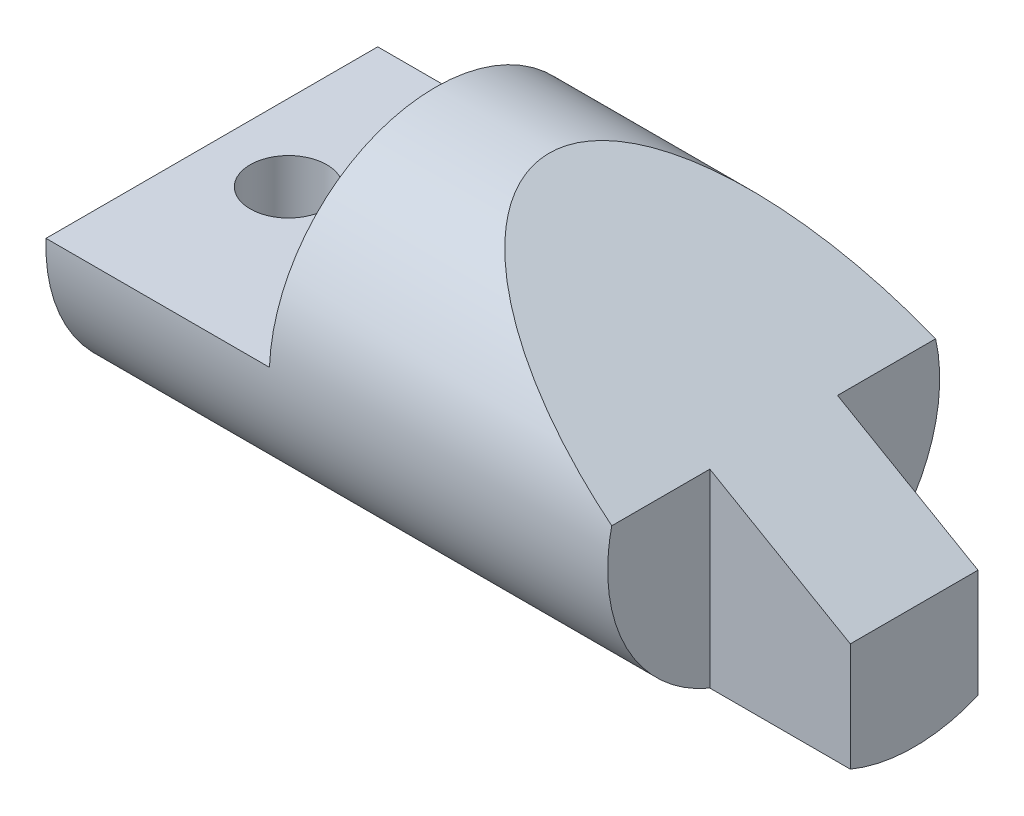
ISO-10303-21;
HEADER;
FILE_DESCRIPTION(('STEP AP214'),'2;1');
FILE_NAME('part.step','',(''),(''),'','','');
FILE_SCHEMA(('AUTOMOTIVE_DESIGN { 1 0 10303 214 1 1 1 1 }'));
ENDSEC;
DATA;
#1=APPLICATION_CONTEXT('core data for automotive mechanical design processes');
#2=APPLICATION_PROTOCOL_DEFINITION('international standard','automotive_design',2000,#1);
#3=PRODUCT_CONTEXT('',#1,'mechanical');
#4=PRODUCT('Part','Part','',(#3));
#5=PRODUCT_RELATED_PRODUCT_CATEGORY('part','',(#4));
#6=PRODUCT_DEFINITION_FORMATION('','',#4);
#7=PRODUCT_DEFINITION_CONTEXT('part definition',#1,'design');
#8=PRODUCT_DEFINITION('design','',#6,#7);
#9=PRODUCT_DEFINITION_SHAPE('','',#8);
#10=(LENGTH_UNIT() NAMED_UNIT(*) SI_UNIT(.MILLI.,.METRE.));
#11=(NAMED_UNIT(*) PLANE_ANGLE_UNIT() SI_UNIT($,.RADIAN.));
#12=(NAMED_UNIT(*) SI_UNIT($,.STERADIAN.) SOLID_ANGLE_UNIT());
#13=UNCERTAINTY_MEASURE_WITH_UNIT(LENGTH_MEASURE(1.E-05),#10,'distance_accuracy_value','');
#14=(GEOMETRIC_REPRESENTATION_CONTEXT(3) GLOBAL_UNCERTAINTY_ASSIGNED_CONTEXT((#13)) GLOBAL_UNIT_ASSIGNED_CONTEXT((#10,
#11,#12)) REPRESENTATION_CONTEXT('',''));
#15=CARTESIAN_POINT('',(0.,0.,0.));
#16=DIRECTION('',(0.,0.,1.));
#17=DIRECTION('',(1.,0.,0.));
#18=AXIS2_PLACEMENT_3D('',#15,#16,#17);
#19=CARTESIAN_POINT('',(110.,0.,0.));
#20=DIRECTION('',(-1.,0.,0.));
#21=DIRECTION('',(0.,0.,1.));
#22=AXIS2_PLACEMENT_3D('',#19,#20,#21);
#23=CYLINDRICAL_SURFACE('',#22,26.);
#24=CARTESIAN_POINT('',(12.,-25.298221281347,6.));
#25=CARTESIAN_POINT('',(11.8338596092283,-25.2982186168234,6.00000426699578));
#26=CARTESIAN_POINT('',(11.6677682398889,-25.2998607859314,5.99309795994757));
#27=CARTESIAN_POINT('',(11.3367454187584,-25.3063739393443,5.96553937626017));
#28=CARTESIAN_POINT('',(11.171814129202,-25.3112453665251,5.94488521417248));
#29=CARTESIAN_POINT('',(10.8442914295955,-25.3240766640158,5.88998541702547));
#30=CARTESIAN_POINT('',(10.6817009897915,-25.3320377787861,5.85573430527684));
#31=CARTESIAN_POINT('',(10.3600133150648,-25.3508138996234,5.77390652099875));
#32=CARTESIAN_POINT('',(10.2009173930992,-25.3616299591317,5.72632492927967));
#33=CARTESIAN_POINT('',(9.88763244979479,-25.3857782730932,5.61830189272332));
#34=CARTESIAN_POINT('',(9.73343615850164,-25.3991065745931,5.55788063202718));
#35=CARTESIAN_POINT('',(9.43067431566343,-25.4279121015355,5.4245677515505));
#36=CARTESIAN_POINT('',(9.28211086812178,-25.4433901200766,5.35167152704644));
#37=CARTESIAN_POINT('',(8.99171038121903,-25.4760474563589,5.19398525284812));
#38=CARTESIAN_POINT('',(8.84987073853116,-25.4932261075591,5.10919985757711));
#39=CARTESIAN_POINT('',(8.57371971231115,-25.5288197408225,4.92827180844513));
#40=CARTESIAN_POINT('',(8.43941117979342,-25.5472351853712,4.83212489574422));
#41=CARTESIAN_POINT('',(8.17708400889766,-25.5851042747505,4.62746622255838));
#42=CARTESIAN_POINT('',(8.04920607675449,-25.6045700506075,4.51877631184721));
#43=CARTESIAN_POINT('',(7.80297159714609,-25.6437178101008,4.29104725883859));
#44=CARTESIAN_POINT('',(7.68461859949208,-25.6633998712663,4.17200429217533));
#45=CARTESIAN_POINT('',(7.45830580131009,-25.702423281932,3.92442775118071));
#46=CARTESIAN_POINT('',(7.35034308479037,-25.721764725773,3.79589685759739));
#47=CARTESIAN_POINT('',(7.14546982000557,-25.7595869691649,3.53011349345323));
#48=CARTESIAN_POINT('',(7.04856335802128,-25.7780674490287,3.39285782730012));
#49=CARTESIAN_POINT('',(6.86548641571272,-25.8138543103492,3.1089581991746));
#50=CARTESIAN_POINT('',(6.77945138072909,-25.8311448485142,2.96222482563555));
#51=CARTESIAN_POINT('',(6.62004187971231,-25.8638330810239,2.66176458350471));
#52=CARTESIAN_POINT('',(6.54667218486704,-25.879230061417,2.50803510683321));
#53=CARTESIAN_POINT('',(6.41323326811326,-25.9076764656952,2.19476325401493));
#54=CARTESIAN_POINT('',(6.35315782033565,-25.9207269879179,2.03522363977197));
#55=CARTESIAN_POINT('',(6.24673180092865,-25.9441215771745,1.71143932954673));
#56=CARTESIAN_POINT('',(6.2003861804684,-25.9544646677143,1.5471929596019));
#57=CARTESIAN_POINT('',(6.08400245976789,-25.9806279305608,1.05494501508443));
#58=CARTESIAN_POINT('',(6.03413177498501,-25.9921298380189,0.721572970925529));
#59=CARTESIAN_POINT('',(6.00164160636246,-25.9996222178507,0.219200696397592));
#60=CARTESIAN_POINT('',(5.997871100763,-26.0004913374011,0.0512905335849101));
#61=CARTESIAN_POINT('',(6.00439061305633,-25.9989867752056,-0.28426266864682));
#62=CARTESIAN_POINT('',(6.01468081721394,-25.9966130505011,-0.451905704497733));
#63=CARTESIAN_POINT('',(6.06595399040325,-25.9848332325725,-0.946143346731944));
#64=CARTESIAN_POINT('',(6.12692197032201,-25.9708629188291,-1.27078082255708));
#65=CARTESIAN_POINT('',(6.30091545747847,-25.9320748267591,-1.90491648972239));
#66=CARTESIAN_POINT('',(6.41394348546702,-25.907256523175,-2.21441394717911));
#67=CARTESIAN_POINT('',(6.68975214973851,-25.8491870231339,-2.81256896635929));
#68=CARTESIAN_POINT('',(6.85292259116338,-25.8158701164867,-3.10104052915992));
#69=CARTESIAN_POINT('',(7.22409121318011,-25.7444407348534,-3.64687359141418));
#70=CARTESIAN_POINT('',(7.43209613847233,-25.7063275386942,-3.90423040100034));
#71=CARTESIAN_POINT('',(7.89272700140077,-25.6284430543298,-4.38681075802379));
#72=CARTESIAN_POINT('',(8.14627364587873,-25.588653804612,-4.61115349777712));
#73=CARTESIAN_POINT('',(8.68780493189074,-25.5127202462123,-5.0143111751951));
#74=CARTESIAN_POINT('',(8.97579073322763,-25.4765760603604,-5.19312457893953));
#75=CARTESIAN_POINT('',(9.57956102723888,-25.4119707291034,-5.5006028741194));
#76=CARTESIAN_POINT('',(9.89544202964118,-25.3835377625613,-5.62908458008033));
#77=CARTESIAN_POINT('',(10.5451271094168,-25.3379522391704,-5.83086533091266));
#78=CARTESIAN_POINT('',(10.8789279724591,-25.3207976665517,-5.90417423707244));
#79=CARTESIAN_POINT('',(11.5468836785248,-25.3001269614723,-5.99212728798865));
#80=CARTESIAN_POINT('',(11.8808595896817,-25.2963109960261,-6.00806138849856));
#81=CARTESIAN_POINT('',(12.5466961543681,-25.3019380241938,-5.98431936297218));
#82=CARTESIAN_POINT('',(12.8785569691508,-25.3113799945877,-5.94464752848658));
#83=CARTESIAN_POINT('',(13.5261421610431,-25.3421742930984,-5.8119438680545));
#84=CARTESIAN_POINT('',(13.8420236017125,-25.363364612613,-5.71963738596624));
#85=CARTESIAN_POINT('',(14.4538352052248,-25.415119049277,-5.48507577932331));
#86=CARTESIAN_POINT('',(14.7497632805569,-25.4456841453603,-5.34281543825688));
#87=CARTESIAN_POINT('',(15.3188058686108,-25.513392623152,-5.00959972635545));
#88=CARTESIAN_POINT('',(15.5914476089792,-25.5506389044147,-4.81785842909055));
#89=CARTESIAN_POINT('',(16.1011625009439,-25.6272493902105,-4.39212255336452));
#90=CARTESIAN_POINT('',(16.3382307011576,-25.6666138885384,-4.15812210293797));
#91=CARTESIAN_POINT('',(16.7751392585067,-25.7440220559931,-3.64870430326475));
#92=CARTESIAN_POINT('',(16.9740950132877,-25.7820207369392,-3.3725215516733));
#93=CARTESIAN_POINT('',(17.3228366844758,-25.8515613819952,-2.78971810867866));
#94=CARTESIAN_POINT('',(17.4726250217897,-25.8831036639768,-2.48309891687435));
#95=CARTESIAN_POINT('',(17.6564412006975,-25.9228060540511,-2.00832516560109));
#96=CARTESIAN_POINT('',(17.7108034430978,-25.9347480305856,-1.84807757920985));
#97=CARTESIAN_POINT('',(17.8058398876408,-25.9558394938161,-1.52340969359614));
#98=CARTESIAN_POINT('',(17.8465191923752,-25.9649900213704,-1.35899097451099));
#99=CARTESIAN_POINT('',(17.9138487056317,-25.9802335618391,-1.0271663769341));
#100=CARTESIAN_POINT('',(17.9404980562908,-25.986326387789,-0.859760316427947));
#101=CARTESIAN_POINT('',(17.979543583107,-25.9952799041029,-0.523210151651065));
#102=CARTESIAN_POINT('',(17.9919403474974,-25.9981407278582,-0.354066119400699));
#103=CARTESIAN_POINT('',(18.0022525980237,-26.0005194885881,-0.0192310557557203));
#104=CARTESIAN_POINT('',(18.0004961135576,-26.0001131489793,0.146449443201364));
#105=CARTESIAN_POINT('',(17.9832945571785,-25.996148628576,0.477057701933478));
#106=CARTESIAN_POINT('',(17.9678497719488,-25.9925905137913,0.641985477400592));
#107=CARTESIAN_POINT('',(17.9233958590374,-25.9824200457169,0.969931810978151));
#108=CARTESIAN_POINT('',(17.8943846362122,-25.9758072206726,1.1329500702035));
#109=CARTESIAN_POINT('',(17.8230455182532,-25.9597121222947,1.45583933383539));
#110=CARTESIAN_POINT('',(17.7807223523842,-25.9502308680587,1.6157114345616));
#111=CARTESIAN_POINT('',(17.6832685393704,-25.9286963290247,1.93068295813026));
#112=CARTESIAN_POINT('',(17.6281850065142,-25.9166525188094,2.08579761719463));
#113=CARTESIAN_POINT('',(17.5055669137773,-25.8903009895851,2.39076000896137));
#114=CARTESIAN_POINT('',(17.4380367190478,-25.8759940645186,2.54060956631106));
#115=CARTESIAN_POINT('',(17.2909740074304,-25.8454876543624,2.83417683286135));
#116=CARTESIAN_POINT('',(17.2114363365128,-25.8292873572488,2.97789187476795));
#117=CARTESIAN_POINT('',(17.0409683903279,-25.7954334912069,3.25814832069005));
#118=CARTESIAN_POINT('',(16.9500419371224,-25.7777804105095,3.39469210965167));
#119=CARTESIAN_POINT('',(16.7553417194497,-25.7410944607736,3.66261191962293));
#120=CARTESIAN_POINT('',(16.6513360980806,-25.7220402489745,3.79381657677358));
#121=CARTESIAN_POINT('',(16.4328099081178,-25.6834235526423,4.04699277818301));
#122=CARTESIAN_POINT('',(16.3182929762012,-25.6638612455658,4.16896748934823));
#123=CARTESIAN_POINT('',(16.0794029906461,-25.6247466274483,4.40300442252597));
#124=CARTESIAN_POINT('',(15.9550240587642,-25.6051943294673,4.51506064713466));
#125=CARTESIAN_POINT('',(15.6973352346976,-25.5666592890338,4.72839094018174));
#126=CARTESIAN_POINT('',(15.5640286148976,-25.5476763415437,4.82966892445057));
#127=CARTESIAN_POINT('',(15.2871597830313,-25.5105137762764,5.02229658254855));
#128=CARTESIAN_POINT('',(15.1434695625505,-25.4923514163345,5.11346573218804));
#129=CARTESIAN_POINT('',(14.8487691957087,-25.4576920118662,5.28331620580679));
#130=CARTESIAN_POINT('',(14.6977617709443,-25.4411943550938,5.36200212701755));
#131=CARTESIAN_POINT('',(14.3894943123739,-25.410356009018,5.50629238311504));
#132=CARTESIAN_POINT('',(14.2322375253279,-25.3960142177221,5.57190340699332));
#133=CARTESIAN_POINT('',(13.9125752914521,-25.3699140540934,5.68955860768429));
#134=CARTESIAN_POINT('',(13.7501707229381,-25.3581552437378,5.7416050850566));
#135=CARTESIAN_POINT('',(13.3281294425102,-25.3317592254888,5.85724552403384));
#136=CARTESIAN_POINT('',(13.0655023159913,-25.3192617409978,5.91069337455311));
#137=CARTESIAN_POINT('',(12.5352075486843,-25.3024951636455,5.9820661004657));
#138=CARTESIAN_POINT('',(12.2675402143716,-25.2982255720991,5.99999312874515));
#139=CARTESIAN_POINT('',(12.,-25.298221281347,6.));
#140=B_SPLINE_CURVE_WITH_KNOTS('',3,(#24,#25,#26,#27,#28,#29,#30,#31,#32,#33,#34,#35,#36,#37,
#38,#39,#40,#41,#42,#43,#44,#45,#46,#47,#48,#49,#50,#51,#52,#53,#54,#55,#56,#57,#58,#59,#60,#61,
#62,#63,#64,#65,#66,#67,#68,#69,#70,#71,#72,#73,#74,#75,#76,#77,#78,#79,#80,#81,#82,#83,#84,#85,
#86,#87,#88,#89,#90,#91,#92,#93,#94,#95,#96,#97,#98,#99,#100,#101,#102,#103,#104,#105,#106,#107,
#108,#109,#110,#111,#112,#113,#114,#115,#116,#117,#118,#119,#120,#121,#122,#123,#124,#125,#126,
#127,#128,#129,#130,#131,#132,#133,#134,#135,#136,#137,#138,#139),.UNSPECIFIED.,.T.,.F.,(4,2,2,
2,2,2,2,2,2,2,2,2,2,2,2,2,2,2,2,2,2,2,2,2,2,2,2,2,2,2,2,2,2,2,2,2,2,2,2,2,2,2,2,2,2,2,2,2,2,2,2,
2,2,2,2,2,2,4),(0.,0.498185318993146,0.996438975653758,1.49489352690978,1.99353225979219,
2.4913928488573,2.98943760476397,3.48728792551383,3.98532545990866,4.49159721170706,
4.99805677854564,5.50437379244965,6.01087733397209,6.52317305541541,7.03566134572828,
7.54790912078348,8.06034139537044,9.06627550435372,9.5696418910752,10.073014946049,
11.0597830877433,12.0465990138376,13.0412892576212,14.0361292427476,15.0539771711765,
16.071859387191,17.0934125769577,18.114783136432,19.1130416499756,20.1112231242403,
21.0959703419585,22.0808204240791,23.082395536902,24.0841099271457,25.1068235977182,
26.1294869043278,26.6378873531896,27.1460980004513,27.6543397186987,28.1625604600198,
28.6590366649466,29.1555024720807,29.6520449766344,30.1484112759846,30.6429732888068,
31.1373621833862,31.6319638935681,32.1264000585263,32.631338067032,33.1361020321371,
33.6411691566771,34.1460521548756,34.6588497085716,35.171457972363,35.6838033136372,
36.196061704038,36.9983511739371,37.8005920162819),.UNSPECIFIED.);
#141=CARTESIAN_POINT('',(12.,-25.298221281347,6.));
#142=VERTEX_POINT('',#141);
#143=EDGE_CURVE('E129',#142,#142,#140,.T.);
#144=ORIENTED_EDGE('',*,*,#143,.F.);
#145=EDGE_LOOP('',(#144));
#146=FACE_BOUND('',#145,.T.);
#147=DIRECTION('',(-1.,0.,0.));
#148=VECTOR('',#147,1.);
#149=CARTESIAN_POINT('',(110.,0.999999999999994,-25.9807621135332));
#150=LINE('',#149,#148);
#151=CARTESIAN_POINT('',(35.,0.999999999999994,-25.9807621135332));
#152=VERTEX_POINT('',#151);
#153=CARTESIAN_POINT('',(0.,0.999999999999994,-25.9807621135332));
#154=VERTEX_POINT('',#153);
#155=EDGE_CURVE('E137',#152,#154,#150,.T.);
#156=ORIENTED_EDGE('',*,*,#155,.F.);
#157=CARTESIAN_POINT('',(35.,0.,0.));
#158=DIRECTION('',(-1.,0.,0.));
#159=DIRECTION('',(0.,0.,1.));
#160=AXIS2_PLACEMENT_3D('',#157,#158,#159);
#161=CIRCLE('',#160,26.);
#162=CARTESIAN_POINT('',(35.,0.999999999999994,25.9807621135332));
#163=VERTEX_POINT('',#162);
#164=EDGE_CURVE('E171',#152,#163,#161,.F.);
#165=ORIENTED_EDGE('',*,*,#164,.T.);
#166=DIRECTION('',(-1.,0.,0.));
#167=VECTOR('',#166,1.);
#168=CARTESIAN_POINT('',(110.,0.999999999999994,25.9807621135332));
#169=LINE('',#168,#167);
#170=CARTESIAN_POINT('',(0.,0.999999999999994,25.9807621135332));
#171=VERTEX_POINT('',#170);
#172=EDGE_CURVE('E177',#163,#171,#169,.T.);
#173=ORIENTED_EDGE('',*,*,#172,.T.);
#174=CARTESIAN_POINT('',(0.,0.,0.));
#175=DIRECTION('',(1.,0.,0.));
#176=DIRECTION('',(0.,0.,-1.));
#177=AXIS2_PLACEMENT_3D('',#174,#175,#176);
#178=CIRCLE('',#177,26.);
#179=EDGE_CURVE('E36',#171,#154,#178,.T.);
#180=ORIENTED_EDGE('',*,*,#179,.T.);
#181=EDGE_LOOP('',(#156,#165,#173,#180));
#182=FACE_BOUND('',#181,.T.);
#183=CARTESIAN_POINT('',(88.,0.,0.));
#184=DIRECTION('',(1.,0.,0.));
#185=DIRECTION('',(0.,0.,-1.));
#186=AXIS2_PLACEMENT_3D('',#183,#184,#185);
#187=CIRCLE('',#186,26.);
#188=CARTESIAN_POINT('',(88.,5.70170592217159,-25.3671155155069));
#189=VERTEX_POINT('',#188);
#190=CARTESIAN_POINT('',(88.,-24.,-9.99999999999999));
#191=VERTEX_POINT('',#190);
#192=EDGE_CURVE('E92',#189,#191,#187,.F.);
#193=ORIENTED_EDGE('',*,*,#192,.T.);
#194=DIRECTION('',(-1.,0.,0.));
#195=VECTOR('',#194,1.);
#196=CARTESIAN_POINT('',(110.,-24.,-9.99999999999999));
#197=LINE('',#196,#195);
#198=CARTESIAN_POINT('',(110.,-24.,-9.99999999999999));
#199=VERTEX_POINT('',#198);
#200=EDGE_CURVE('E99',#199,#191,#197,.T.);
#201=ORIENTED_EDGE('',*,*,#200,.F.);
#202=CARTESIAN_POINT('',(110.,0.,0.));
#203=DIRECTION('',(1.,0.,0.));
#204=DIRECTION('',(0.,0.,-1.));
#205=AXIS2_PLACEMENT_3D('',#202,#203,#204);
#206=CIRCLE('',#205,26.);
#207=CARTESIAN_POINT('',(110.,-24.,10.));
#208=VERTEX_POINT('',#207);
#209=EDGE_CURVE('E11',#208,#199,#206,.T.);
#210=ORIENTED_EDGE('',*,*,#209,.F.);
#211=DIRECTION('',(-1.,0.,0.));
#212=VECTOR('',#211,1.);
#213=CARTESIAN_POINT('',(110.,-24.,10.));
#214=LINE('',#213,#212);
#215=CARTESIAN_POINT('',(88.,-24.,10.));
#216=VERTEX_POINT('',#215);
#217=EDGE_CURVE('E116',#216,#208,#214,.F.);
#218=ORIENTED_EDGE('',*,*,#217,.F.);
#219=CARTESIAN_POINT('',(88.,0.,0.));
#220=DIRECTION('',(1.,0.,0.));
#221=DIRECTION('',(0.,0.,-1.));
#222=AXIS2_PLACEMENT_3D('',#219,#220,#221);
#223=CIRCLE('',#222,26.);
#224=CARTESIAN_POINT('',(88.,5.70170592217159,25.3671155155069));
#225=VERTEX_POINT('',#224);
#226=EDGE_CURVE('E123',#216,#225,#223,.F.);
#227=ORIENTED_EDGE('',*,*,#226,.T.);
#228=CARTESIAN_POINT('',(97.8756443470177,0.,0.));
#229=DIRECTION('',(0.499999999999995,0.866025403784442,0.));
#230=DIRECTION('',(-0.866025403784442,0.499999999999995,0.));
#231=AXIS2_PLACEMENT_3D('',#228,#229,#230);
#232=ELLIPSE('',#231,52.0000000000005,26.);
#233=EDGE_CURVE('E110',#225,#189,#232,.F.);
#234=ORIENTED_EDGE('',*,*,#233,.T.);
#235=EDGE_LOOP('',(#193,#201,#210,#218,#227,#234));
#236=FACE_BOUND('',#235,.T.);
#237=ADVANCED_FACE('F33',(#146,#182,#236),#23,.T.);
#238=CARTESIAN_POINT('',(110.,0.,0.));
#239=DIRECTION('',(1.,0.,0.));
#240=DIRECTION('',(0.,0.,-1.));
#241=AXIS2_PLACEMENT_3D('',#238,#239,#240);
#242=PLANE('',#241);
#243=ORIENTED_EDGE('',*,*,#209,.T.);
#244=DIRECTION('',(0.,1.,0.));
#245=VECTOR('',#244,1.);
#246=CARTESIAN_POINT('',(110.,-26.001,-9.99999999999999));
#247=LINE('',#246,#245);
#248=CARTESIAN_POINT('',(110.,-7.00000000000001,-9.99999999999999));
#249=VERTEX_POINT('',#248);
#250=EDGE_CURVE('E102',#199,#249,#247,.T.);
#251=ORIENTED_EDGE('',*,*,#250,.T.);
#252=DIRECTION('',(0.,0.,-1.));
#253=VECTOR('',#252,1.);
#254=CARTESIAN_POINT('',(110.,-7.00000000000001,26.001));
#255=LINE('',#254,#253);
#256=CARTESIAN_POINT('',(110.,-7.00000000000001,10.));
#257=VERTEX_POINT('',#256);
#258=EDGE_CURVE('E176',#257,#249,#255,.T.);
#259=ORIENTED_EDGE('',*,*,#258,.F.);
#260=DIRECTION('',(0.,1.,0.));
#261=VECTOR('',#260,1.);
#262=CARTESIAN_POINT('',(110.,-26.001,10.));
#263=LINE('',#262,#261);
#264=EDGE_CURVE('E55',#208,#257,#263,.T.);
#265=ORIENTED_EDGE('',*,*,#264,.F.);
#266=EDGE_LOOP('',(#243,#251,#259,#265));
#267=FACE_BOUND('',#266,.T.);
#268=ADVANCED_FACE('F157',(#267),#242,.T.);
#269=CARTESIAN_POINT('',(52.8423233502262,26.,26.001));
#270=DIRECTION('',(0.499999999999995,0.866025403784442,0.));
#271=DIRECTION('',(-0.866025403784442,0.499999999999995,0.));
#272=AXIS2_PLACEMENT_3D('',#269,#270,#271);
#273=PLANE('',#272);
#274=DIRECTION('',(0.866025403784442,-0.499999999999995,0.));
#275=VECTOR('',#274,1.);
#276=CARTESIAN_POINT('',(79.2101478248548,10.7765294416286,-9.99999999999999));
#277=LINE('',#276,#275);
#278=CARTESIAN_POINT('',(88.,5.70170592217159,-9.99999999999999));
#279=VERTEX_POINT('',#278);
#280=EDGE_CURVE('E112',#279,#249,#277,.T.);
#281=ORIENTED_EDGE('',*,*,#280,.F.);
#282=DIRECTION('',(0.,0.,1.));
#283=VECTOR('',#282,1.);
#284=CARTESIAN_POINT('',(88.,5.70170592217159,-26.));
#285=LINE('',#284,#283);
#286=EDGE_CURVE('E94',#189,#279,#285,.T.);
#287=ORIENTED_EDGE('',*,*,#286,.F.);
#288=ORIENTED_EDGE('',*,*,#233,.F.);
#289=DIRECTION('',(0.,0.,1.));
#290=VECTOR('',#289,1.);
#291=CARTESIAN_POINT('',(88.,5.70170592217159,10.));
#292=LINE('',#291,#290);
#293=CARTESIAN_POINT('',(88.,5.70170592217159,10.));
#294=VERTEX_POINT('',#293);
#295=EDGE_CURVE('E121',#294,#225,#292,.T.);
#296=ORIENTED_EDGE('',*,*,#295,.F.);
#297=DIRECTION('',(-0.866025403784442,0.499999999999995,0.));
#298=VECTOR('',#297,1.);
#299=CARTESIAN_POINT('',(95.710147824855,1.25024999999982,10.));
#300=LINE('',#299,#298);
#301=EDGE_CURVE('E119',#257,#294,#300,.T.);
#302=ORIENTED_EDGE('',*,*,#301,.F.);
#303=ORIENTED_EDGE('',*,*,#258,.T.);
#304=EDGE_LOOP('',(#281,#287,#288,#296,#302,#303));
#305=FACE_BOUND('',#304,.T.);
#306=ADVANCED_FACE('F162',(#305),#273,.T.);
#307=CARTESIAN_POINT('',(0.,0.999999999999994,26.001));
#308=DIRECTION('',(0.,1.,0.));
#309=DIRECTION('',(0.,0.,1.));
#310=AXIS2_PLACEMENT_3D('',#307,#308,#309);
#311=PLANE('',#310);
#312=CARTESIAN_POINT('',(12.,0.999999999999994,0.));
#313=DIRECTION('',(0.,1.,0.));
#314=DIRECTION('',(0.,0.,1.));
#315=AXIS2_PLACEMENT_3D('',#312,#313,#314);
#316=CIRCLE('',#315,6.);
#317=CARTESIAN_POINT('',(12.,0.999999999999994,6.));
#318=VERTEX_POINT('',#317);
#319=EDGE_CURVE('E96',#318,#318,#316,.T.);
#320=ORIENTED_EDGE('',*,*,#319,.F.);
#321=EDGE_LOOP('',(#320));
#322=FACE_BOUND('',#321,.T.);
#323=DIRECTION('',(0.,0.,-1.));
#324=VECTOR('',#323,1.);
#325=CARTESIAN_POINT('',(35.,0.999999999999994,26.001));
#326=LINE('',#325,#324);
#327=EDGE_CURVE('E186',#163,#152,#326,.T.);
#328=ORIENTED_EDGE('',*,*,#327,.T.);
#329=ORIENTED_EDGE('',*,*,#155,.T.);
#330=DIRECTION('',(0.,0.,-1.));
#331=VECTOR('',#330,1.);
#332=CARTESIAN_POINT('',(0.,0.999999999999994,26.001));
#333=LINE('',#332,#331);
#334=EDGE_CURVE('E184',#171,#154,#333,.T.);
#335=ORIENTED_EDGE('',*,*,#334,.F.);
#336=ORIENTED_EDGE('',*,*,#172,.F.);
#337=EDGE_LOOP('',(#328,#329,#335,#336));
#338=FACE_BOUND('',#337,.T.);
#339=ADVANCED_FACE('F191',(#322,#338),#311,.T.);
#340=CARTESIAN_POINT('',(35.,0.999999999999994,26.001));
#341=DIRECTION('',(-1.,0.,0.));
#342=DIRECTION('',(0.,0.,1.));
#343=AXIS2_PLACEMENT_3D('',#340,#341,#342);
#344=PLANE('',#343);
#345=ORIENTED_EDGE('',*,*,#327,.F.);
#346=ORIENTED_EDGE('',*,*,#164,.F.);
#347=EDGE_LOOP('',(#345,#346));
#348=FACE_BOUND('',#347,.T.);
#349=ADVANCED_FACE('F193',(#348),#344,.T.);
#350=CARTESIAN_POINT('',(0.,0.,0.));
#351=DIRECTION('',(1.,0.,0.));
#352=DIRECTION('',(0.,0.,-1.));
#353=AXIS2_PLACEMENT_3D('',#350,#351,#352);
#354=PLANE('',#353);
#355=ORIENTED_EDGE('',*,*,#334,.T.);
#356=ORIENTED_EDGE('',*,*,#179,.F.);
#357=EDGE_LOOP('',(#355,#356));
#358=FACE_BOUND('',#357,.T.);
#359=ADVANCED_FACE('F190',(#358),#354,.F.);
#360=CARTESIAN_POINT('',(12.,-26.001,0.));
#361=DIRECTION('',(0.,1.,0.));
#362=DIRECTION('',(0.,0.,1.));
#363=AXIS2_PLACEMENT_3D('',#360,#361,#362);
#364=CYLINDRICAL_SURFACE('',#363,6.);
#365=ORIENTED_EDGE('',*,*,#319,.T.);
#366=EDGE_LOOP('',(#365));
#367=FACE_BOUND('',#366,.T.);
#368=ORIENTED_EDGE('',*,*,#143,.T.);
#369=EDGE_LOOP('',(#368));
#370=FACE_BOUND('',#369,.T.);
#371=ADVANCED_FACE('F139',(#367,#370),#364,.F.);
#372=CARTESIAN_POINT('',(88.,26.001,10.));
#373=DIRECTION('',(1.,0.,0.));
#374=DIRECTION('',(0.,0.,-1.));
#375=AXIS2_PLACEMENT_3D('',#372,#373,#374);
#376=PLANE('',#375);
#377=DIRECTION('',(0.,-1.,0.));
#378=VECTOR('',#377,1.);
#379=CARTESIAN_POINT('',(88.,26.001,10.));
#380=LINE('',#379,#378);
#381=EDGE_CURVE('E105',#294,#216,#380,.T.);
#382=ORIENTED_EDGE('',*,*,#381,.F.);
#383=ORIENTED_EDGE('',*,*,#295,.T.);
#384=ORIENTED_EDGE('',*,*,#226,.F.);
#385=EDGE_LOOP('',(#382,#383,#384));
#386=FACE_BOUND('',#385,.T.);
#387=ADVANCED_FACE('F144',(#386),#376,.T.);
#388=CARTESIAN_POINT('',(110.,26.001,10.));
#389=DIRECTION('',(0.,0.,1.));
#390=DIRECTION('',(1.,0.,0.));
#391=AXIS2_PLACEMENT_3D('',#388,#389,#390);
#392=PLANE('',#391);
#393=ORIENTED_EDGE('',*,*,#301,.T.);
#394=ORIENTED_EDGE('',*,*,#381,.T.);
#395=ORIENTED_EDGE('',*,*,#217,.T.);
#396=ORIENTED_EDGE('',*,*,#264,.T.);
#397=EDGE_LOOP('',(#393,#394,#395,#396));
#398=FACE_BOUND('',#397,.T.);
#399=ADVANCED_FACE('F147',(#398),#392,.T.);
#400=CARTESIAN_POINT('',(88.,26.001,-26.));
#401=DIRECTION('',(1.,0.,0.));
#402=DIRECTION('',(0.,0.,-1.));
#403=AXIS2_PLACEMENT_3D('',#400,#401,#402);
#404=PLANE('',#403);
#405=ORIENTED_EDGE('',*,*,#286,.T.);
#406=DIRECTION('',(0.,-1.,0.));
#407=VECTOR('',#406,1.);
#408=CARTESIAN_POINT('',(88.,26.001,-9.99999999999999));
#409=LINE('',#408,#407);
#410=EDGE_CURVE('E47',#279,#191,#409,.T.);
#411=ORIENTED_EDGE('',*,*,#410,.T.);
#412=ORIENTED_EDGE('',*,*,#192,.F.);
#413=EDGE_LOOP('',(#405,#411,#412));
#414=FACE_BOUND('',#413,.T.);
#415=ADVANCED_FACE('F90',(#414),#404,.T.);
#416=CARTESIAN_POINT('',(88.,26.001,-9.99999999999999));
#417=DIRECTION('',(0.,0.,-1.));
#418=DIRECTION('',(-1.,0.,0.));
#419=AXIS2_PLACEMENT_3D('',#416,#417,#418);
#420=PLANE('',#419);
#421=ORIENTED_EDGE('',*,*,#280,.T.);
#422=ORIENTED_EDGE('',*,*,#250,.F.);
#423=ORIENTED_EDGE('',*,*,#200,.T.);
#424=ORIENTED_EDGE('',*,*,#410,.F.);
#425=EDGE_LOOP('',(#421,#422,#423,#424));
#426=FACE_BOUND('',#425,.T.);
#427=ADVANCED_FACE('F100',(#426),#420,.T.);
#428=CLOSED_SHELL('',(#237,#268,#306,#339,#349,#359,#371,#387,#399,#415,#427));
#429=MANIFOLD_SOLID_BREP('B2',#428);
#430=ADVANCED_BREP_SHAPE_REPRESENTATION('',(#18,#429),#14);
#431=SHAPE_DEFINITION_REPRESENTATION(#9,#430);
ENDSEC;
END-ISO-10303-21;
